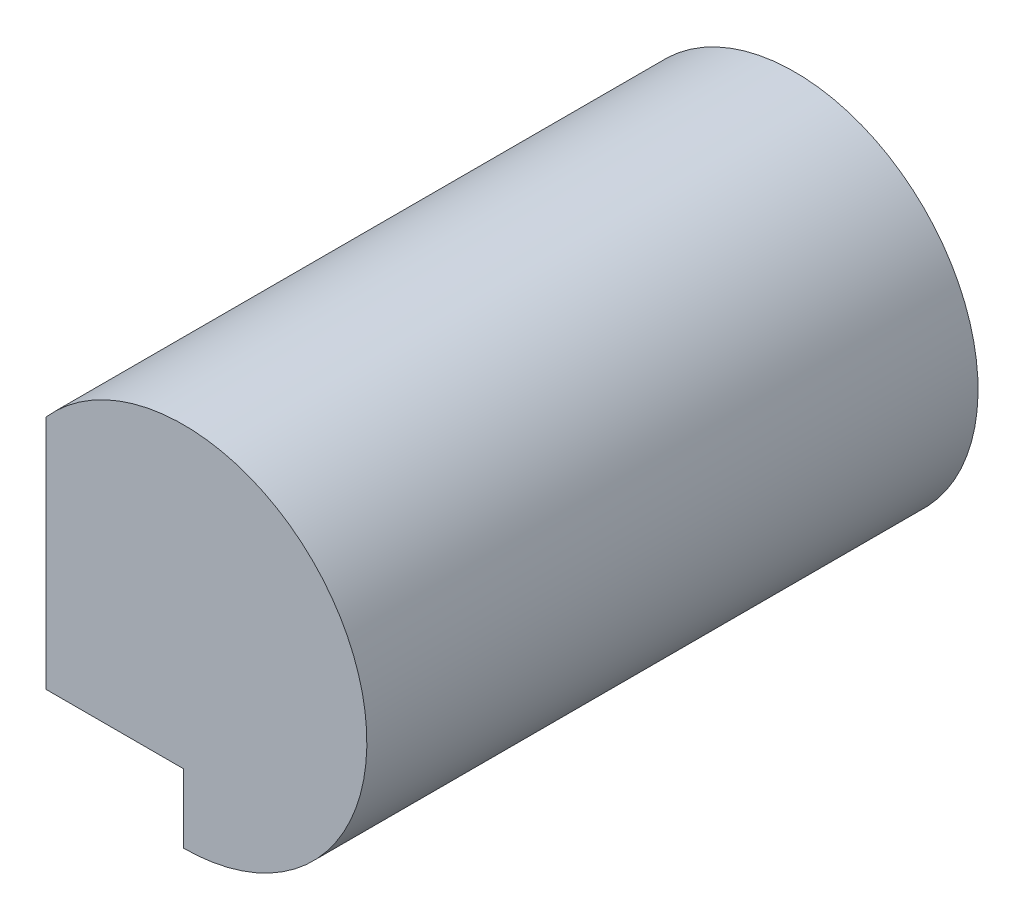
ISO-10303-21;
HEADER;
FILE_DESCRIPTION(('STEP AP214'),'2;1');
FILE_NAME('part.step','',(''),(''),'','','');
FILE_SCHEMA(('AUTOMOTIVE_DESIGN { 1 0 10303 214 1 1 1 1 }'));
ENDSEC;
DATA;
#1=APPLICATION_CONTEXT('core data for automotive mechanical design processes');
#2=APPLICATION_PROTOCOL_DEFINITION('international standard','automotive_design',2000,#1);
#3=PRODUCT_CONTEXT('',#1,'mechanical');
#4=PRODUCT('Part','Part','',(#3));
#5=PRODUCT_RELATED_PRODUCT_CATEGORY('part','',(#4));
#6=PRODUCT_DEFINITION_FORMATION('','',#4);
#7=PRODUCT_DEFINITION_CONTEXT('part definition',#1,'design');
#8=PRODUCT_DEFINITION('design','',#6,#7);
#9=PRODUCT_DEFINITION_SHAPE('','',#8);
#10=(LENGTH_UNIT() NAMED_UNIT(*) SI_UNIT(.MILLI.,.METRE.));
#11=(NAMED_UNIT(*) PLANE_ANGLE_UNIT() SI_UNIT($,.RADIAN.));
#12=(NAMED_UNIT(*) SI_UNIT($,.STERADIAN.) SOLID_ANGLE_UNIT());
#13=UNCERTAINTY_MEASURE_WITH_UNIT(LENGTH_MEASURE(1.E-05),#10,'distance_accuracy_value','');
#14=(GEOMETRIC_REPRESENTATION_CONTEXT(3) GLOBAL_UNCERTAINTY_ASSIGNED_CONTEXT((#13)) GLOBAL_UNIT_ASSIGNED_CONTEXT((#10,
#11,#12)) REPRESENTATION_CONTEXT('',''));
#15=CARTESIAN_POINT('',(0.,0.,0.));
#16=DIRECTION('',(0.,0.,1.));
#17=DIRECTION('',(1.,0.,0.));
#18=AXIS2_PLACEMENT_3D('',#15,#16,#17);
#19=CARTESIAN_POINT('',(0.,0.,20.));
#20=DIRECTION('',(0.,0.,-1.));
#21=DIRECTION('',(0.,-1.,0.));
#22=AXIS2_PLACEMENT_3D('',#19,#20,#21);
#23=CYLINDRICAL_SURFACE('',#22,3.05);
#24=CARTESIAN_POINT('',(0.,0.,0.));
#25=DIRECTION('',(0.,0.,1.));
#26=DIRECTION('',(1.,0.,0.));
#27=AXIS2_PLACEMENT_3D('',#24,#25,#26);
#28=CIRCLE('',#27,3.05);
#29=CARTESIAN_POINT('',(3.05,0.,0.));
#30=VERTEX_POINT('',#29);
#31=EDGE_CURVE('E64',#30,#30,#28,.T.);
#32=ORIENTED_EDGE('',*,*,#31,.F.);
#33=EDGE_LOOP('',(#32));
#34=FACE_BOUND('',#33,.T.);
#35=CARTESIAN_POINT('',(0.,0.,17.));
#36=DIRECTION('',(0.,0.,1.));
#37=DIRECTION('',(1.,0.,0.));
#38=AXIS2_PLACEMENT_3D('',#35,#36,#37);
#39=CIRCLE('',#38,3.05);
#40=CARTESIAN_POINT('',(3.05,0.,17.));
#41=VERTEX_POINT('',#40);
#42=EDGE_CURVE('E9',#41,#41,#39,.T.);
#43=ORIENTED_EDGE('',*,*,#42,.T.);
#44=EDGE_LOOP('',(#43));
#45=FACE_BOUND('',#44,.T.);
#46=ADVANCED_FACE('F15',(#34,#45),#23,.F.);
#47=CARTESIAN_POINT('',(0.,0.,20.));
#48=DIRECTION('',(0.,0.,1.));
#49=DIRECTION('',(1.,0.,0.));
#50=AXIS2_PLACEMENT_3D('',#47,#48,#49);
#51=PLANE('',#50);
#52=DIRECTION('',(0.,1.,0.));
#53=VECTOR('',#52,1.);
#54=CARTESIAN_POINT('',(-4.5,-3.75,20.));
#55=LINE('',#54,#53);
#56=CARTESIAN_POINT('',(-4.5,-3.75,20.));
#57=VERTEX_POINT('',#56);
#58=CARTESIAN_POINT('',(-4.5,3.96862696659688,20.));
#59=VERTEX_POINT('',#58);
#60=EDGE_CURVE('E33',#57,#59,#55,.T.);
#61=ORIENTED_EDGE('',*,*,#60,.F.);
#62=DIRECTION('',(-1.,0.,0.));
#63=VECTOR('',#62,1.);
#64=CARTESIAN_POINT('',(0.,-3.75,20.));
#65=LINE('',#64,#63);
#66=CARTESIAN_POINT('',(0.,-3.75,20.));
#67=VERTEX_POINT('',#66);
#68=EDGE_CURVE('E81',#67,#57,#65,.T.);
#69=ORIENTED_EDGE('',*,*,#68,.F.);
#70=DIRECTION('',(0.,1.,0.));
#71=VECTOR('',#70,1.);
#72=CARTESIAN_POINT('',(0.,-6.,20.));
#73=LINE('',#72,#71);
#74=CARTESIAN_POINT('',(0.,-6.,20.));
#75=VERTEX_POINT('',#74);
#76=EDGE_CURVE('E78',#75,#67,#73,.T.);
#77=ORIENTED_EDGE('',*,*,#76,.F.);
#78=CARTESIAN_POINT('',(0.,0.,20.));
#79=DIRECTION('',(0.,0.,1.));
#80=DIRECTION('',(1.,0.,0.));
#81=AXIS2_PLACEMENT_3D('',#78,#79,#80);
#82=CIRCLE('',#81,6.);
#83=EDGE_CURVE('E24',#75,#59,#82,.T.);
#84=ORIENTED_EDGE('',*,*,#83,.T.);
#85=EDGE_LOOP('',(#61,#69,#77,#84));
#86=FACE_BOUND('',#85,.T.);
#87=ADVANCED_FACE('F108',(#86),#51,.T.);
#88=CARTESIAN_POINT('',(0.,0.,0.));
#89=DIRECTION('',(0.,0.,1.));
#90=DIRECTION('',(1.,0.,0.));
#91=AXIS2_PLACEMENT_3D('',#88,#89,#90);
#92=PLANE('',#91);
#93=DIRECTION('',(-1.,0.,0.));
#94=VECTOR('',#93,1.);
#95=CARTESIAN_POINT('',(0.,-3.75,0.));
#96=LINE('',#95,#94);
#97=CARTESIAN_POINT('',(0.,-3.75,0.));
#98=VERTEX_POINT('',#97);
#99=CARTESIAN_POINT('',(-4.5,-3.75,0.));
#100=VERTEX_POINT('',#99);
#101=EDGE_CURVE('E92',#98,#100,#96,.T.);
#102=ORIENTED_EDGE('',*,*,#101,.T.);
#103=DIRECTION('',(0.,1.,0.));
#104=VECTOR('',#103,1.);
#105=CARTESIAN_POINT('',(-4.5,-3.75,0.));
#106=LINE('',#105,#104);
#107=CARTESIAN_POINT('',(-4.5,3.96862696659688,0.));
#108=VERTEX_POINT('',#107);
#109=EDGE_CURVE('E62',#100,#108,#106,.T.);
#110=ORIENTED_EDGE('',*,*,#109,.T.);
#111=CARTESIAN_POINT('',(0.,0.,0.));
#112=DIRECTION('',(0.,0.,1.));
#113=DIRECTION('',(1.,0.,0.));
#114=AXIS2_PLACEMENT_3D('',#111,#112,#113);
#115=CIRCLE('',#114,6.);
#116=CARTESIAN_POINT('',(0.,-6.,0.));
#117=VERTEX_POINT('',#116);
#118=EDGE_CURVE('E53',#117,#108,#115,.T.);
#119=ORIENTED_EDGE('',*,*,#118,.F.);
#120=DIRECTION('',(0.,1.,0.));
#121=VECTOR('',#120,1.);
#122=CARTESIAN_POINT('',(0.,-6.,0.));
#123=LINE('',#122,#121);
#124=EDGE_CURVE('E60',#117,#98,#123,.T.);
#125=ORIENTED_EDGE('',*,*,#124,.T.);
#126=EDGE_LOOP('',(#102,#110,#119,#125));
#127=FACE_BOUND('',#126,.T.);
#128=ORIENTED_EDGE('',*,*,#31,.T.);
#129=EDGE_LOOP('',(#128));
#130=FACE_BOUND('',#129,.T.);
#131=ADVANCED_FACE('F58',(#127,#130),#92,.F.);
#132=CARTESIAN_POINT('',(0.,0.,20.));
#133=DIRECTION('',(0.,0.,-1.));
#134=DIRECTION('',(0.,-1.,0.));
#135=AXIS2_PLACEMENT_3D('',#132,#133,#134);
#136=CYLINDRICAL_SURFACE('',#135,6.);
#137=ORIENTED_EDGE('',*,*,#118,.T.);
#138=DIRECTION('',(0.,0.,1.));
#139=VECTOR('',#138,1.);
#140=CARTESIAN_POINT('',(-4.5,3.96862696659688,20.));
#141=LINE('',#140,#139);
#142=EDGE_CURVE('E65',#108,#59,#141,.T.);
#143=ORIENTED_EDGE('',*,*,#142,.T.);
#144=ORIENTED_EDGE('',*,*,#83,.F.);
#145=DIRECTION('',(0.,0.,-1.));
#146=VECTOR('',#145,1.);
#147=CARTESIAN_POINT('',(0.,-6.,20.));
#148=LINE('',#147,#146);
#149=EDGE_CURVE('E72',#75,#117,#148,.T.);
#150=ORIENTED_EDGE('',*,*,#149,.T.);
#151=EDGE_LOOP('',(#137,#143,#144,#150));
#152=FACE_BOUND('',#151,.T.);
#153=ADVANCED_FACE('F77',(#152),#136,.T.);
#154=CARTESIAN_POINT('',(0.,-6.,-6.));
#155=DIRECTION('',(1.,0.,0.));
#156=DIRECTION('',(0.,0.,-1.));
#157=AXIS2_PLACEMENT_3D('',#154,#155,#156);
#158=PLANE('',#157);
#159=ORIENTED_EDGE('',*,*,#149,.F.);
#160=ORIENTED_EDGE('',*,*,#76,.T.);
#161=DIRECTION('',(0.,0.,1.));
#162=VECTOR('',#161,1.);
#163=CARTESIAN_POINT('',(0.,-3.75,0.));
#164=LINE('',#163,#162);
#165=EDGE_CURVE('E74',#98,#67,#164,.T.);
#166=ORIENTED_EDGE('',*,*,#165,.F.);
#167=ORIENTED_EDGE('',*,*,#124,.F.);
#168=EDGE_LOOP('',(#159,#160,#166,#167));
#169=FACE_BOUND('',#168,.T.);
#170=ADVANCED_FACE('F70',(#169),#158,.F.);
#171=CARTESIAN_POINT('',(0.,-3.75,-6.));
#172=DIRECTION('',(0.,1.,0.));
#173=DIRECTION('',(-1.,0.,0.));
#174=AXIS2_PLACEMENT_3D('',#171,#172,#173);
#175=PLANE('',#174);
#176=ORIENTED_EDGE('',*,*,#68,.T.);
#177=DIRECTION('',(0.,0.,-1.));
#178=VECTOR('',#177,1.);
#179=CARTESIAN_POINT('',(-4.5,-3.75,20.));
#180=LINE('',#179,#178);
#181=EDGE_CURVE('E18',#57,#100,#180,.T.);
#182=ORIENTED_EDGE('',*,*,#181,.T.);
#183=ORIENTED_EDGE('',*,*,#101,.F.);
#184=ORIENTED_EDGE('',*,*,#165,.T.);
#185=EDGE_LOOP('',(#176,#182,#183,#184));
#186=FACE_BOUND('',#185,.T.);
#187=ADVANCED_FACE('F94',(#186),#175,.F.);
#188=CARTESIAN_POINT('',(-4.5,-7.31425062258868,-25.));
#189=DIRECTION('',(1.,0.,0.));
#190=DIRECTION('',(0.,0.,-1.));
#191=AXIS2_PLACEMENT_3D('',#188,#189,#190);
#192=PLANE('',#191);
#193=ORIENTED_EDGE('',*,*,#109,.F.);
#194=ORIENTED_EDGE('',*,*,#181,.F.);
#195=ORIENTED_EDGE('',*,*,#60,.T.);
#196=ORIENTED_EDGE('',*,*,#142,.F.);
#197=EDGE_LOOP('',(#193,#194,#195,#196));
#198=FACE_BOUND('',#197,.T.);
#199=ADVANCED_FACE('F95',(#198),#192,.F.);
#200=CARTESIAN_POINT('',(0.,0.,17.));
#201=DIRECTION('',(0.,0.,1.));
#202=DIRECTION('',(1.,0.,0.));
#203=AXIS2_PLACEMENT_3D('',#200,#201,#202);
#204=PLANE('',#203);
#205=ORIENTED_EDGE('',*,*,#42,.F.);
#206=EDGE_LOOP('',(#205));
#207=FACE_BOUND('',#206,.T.);
#208=ADVANCED_FACE('F97',(#207),#204,.F.);
#209=CLOSED_SHELL('',(#46,#87,#131,#153,#170,#187,#199,#208));
#210=MANIFOLD_SOLID_BREP('B1',#209);
#211=ADVANCED_BREP_SHAPE_REPRESENTATION('',(#18,#210),#14);
#212=SHAPE_DEFINITION_REPRESENTATION(#9,#211);
ENDSEC;
END-ISO-10303-21;
